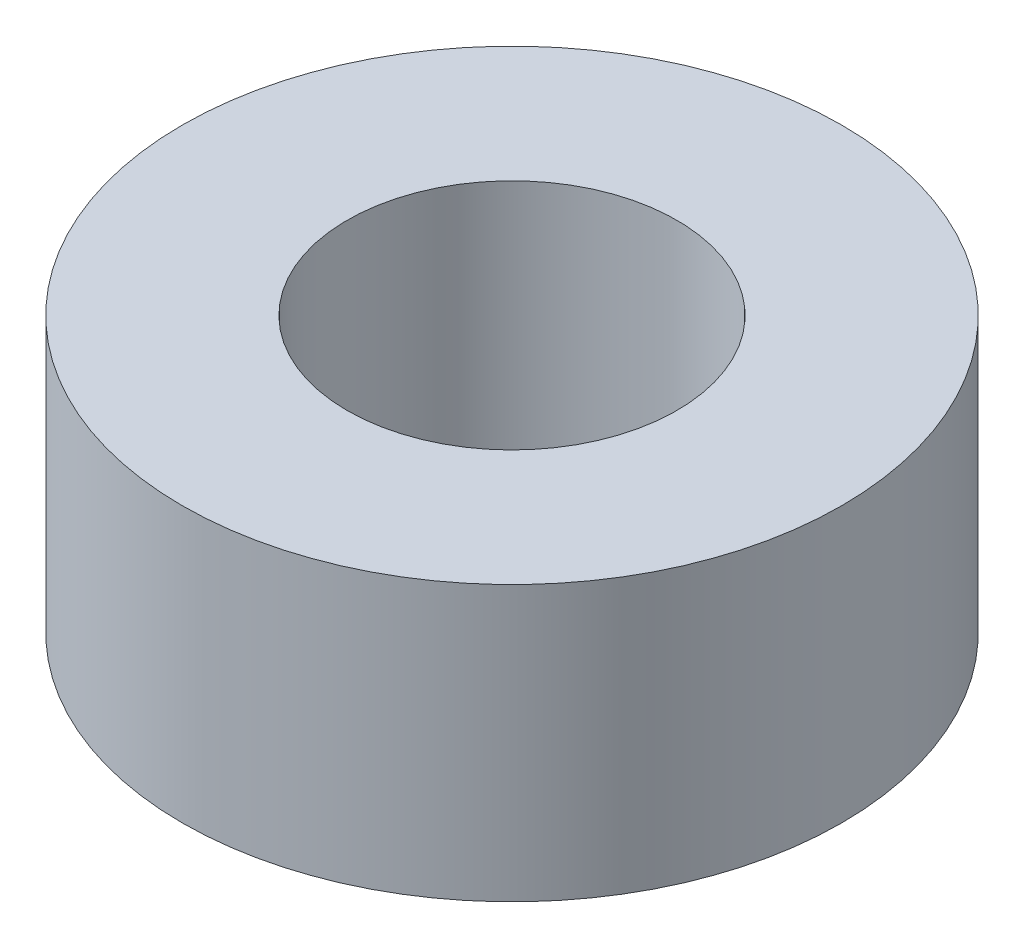
ISO-10303-21;
HEADER;
FILE_DESCRIPTION(('STEP AP214'),'2;1');
FILE_NAME('part.step','',(''),(''),'','','');
FILE_SCHEMA(('AUTOMOTIVE_DESIGN { 1 0 10303 214 1 1 1 1 }'));
ENDSEC;
DATA;
#1=APPLICATION_CONTEXT('core data for automotive mechanical design processes');
#2=APPLICATION_PROTOCOL_DEFINITION('international standard','automotive_design',2000,#1);
#3=PRODUCT_CONTEXT('',#1,'mechanical');
#4=PRODUCT('Part','Part','',(#3));
#5=PRODUCT_RELATED_PRODUCT_CATEGORY('part','',(#4));
#6=PRODUCT_DEFINITION_FORMATION('','',#4);
#7=PRODUCT_DEFINITION_CONTEXT('part definition',#1,'design');
#8=PRODUCT_DEFINITION('design','',#6,#7);
#9=PRODUCT_DEFINITION_SHAPE('','',#8);
#10=(LENGTH_UNIT() NAMED_UNIT(*) SI_UNIT(.MILLI.,.METRE.));
#11=(NAMED_UNIT(*) PLANE_ANGLE_UNIT() SI_UNIT($,.RADIAN.));
#12=(NAMED_UNIT(*) SI_UNIT($,.STERADIAN.) SOLID_ANGLE_UNIT());
#13=UNCERTAINTY_MEASURE_WITH_UNIT(LENGTH_MEASURE(1.E-05),#10,'distance_accuracy_value','');
#14=(GEOMETRIC_REPRESENTATION_CONTEXT(3) GLOBAL_UNCERTAINTY_ASSIGNED_CONTEXT((#13)) GLOBAL_UNIT_ASSIGNED_CONTEXT((#10,
#11,#12)) REPRESENTATION_CONTEXT('',''));
#15=CARTESIAN_POINT('',(0.,0.,0.));
#16=DIRECTION('',(0.,0.,1.));
#17=DIRECTION('',(1.,0.,0.));
#18=AXIS2_PLACEMENT_3D('',#15,#16,#17);
#19=CARTESIAN_POINT('',(0.,2.5,0.));
#20=DIRECTION('',(0.,1.,0.));
#21=DIRECTION('',(0.,0.,1.));
#22=AXIS2_PLACEMENT_3D('',#19,#20,#21);
#23=PLANE('',#22);
#24=CARTESIAN_POINT('',(0.,2.5,0.));
#25=DIRECTION('',(0.,1.,0.));
#26=DIRECTION('',(0.,0.,1.));
#27=AXIS2_PLACEMENT_3D('',#24,#25,#26);
#28=CIRCLE('',#27,3.);
#29=CARTESIAN_POINT('',(0.,2.5,3.));
#30=VERTEX_POINT('',#29);
#31=EDGE_CURVE('E10',#30,#30,#28,.T.);
#32=ORIENTED_EDGE('',*,*,#31,.T.);
#33=EDGE_LOOP('',(#32));
#34=FACE_BOUND('',#33,.T.);
#35=CARTESIAN_POINT('',(0.,2.5,0.));
#36=DIRECTION('',(0.,1.,0.));
#37=DIRECTION('',(0.,0.,1.));
#38=AXIS2_PLACEMENT_3D('',#35,#36,#37);
#39=CIRCLE('',#38,1.5);
#40=CARTESIAN_POINT('',(0.,2.5,1.5));
#41=VERTEX_POINT('',#40);
#42=EDGE_CURVE('E50',#41,#41,#39,.T.);
#43=ORIENTED_EDGE('',*,*,#42,.F.);
#44=EDGE_LOOP('',(#43));
#45=FACE_BOUND('',#44,.T.);
#46=ADVANCED_FACE('F39',(#34,#45),#23,.T.);
#47=CARTESIAN_POINT('',(0.,0.,0.));
#48=DIRECTION('',(0.,1.,0.));
#49=DIRECTION('',(0.,0.,1.));
#50=AXIS2_PLACEMENT_3D('',#47,#48,#49);
#51=PLANE('',#50);
#52=CARTESIAN_POINT('',(0.,0.,0.));
#53=DIRECTION('',(0.,1.,0.));
#54=DIRECTION('',(0.,0.,1.));
#55=AXIS2_PLACEMENT_3D('',#52,#53,#54);
#56=CIRCLE('',#55,3.);
#57=CARTESIAN_POINT('',(0.,0.,3.));
#58=VERTEX_POINT('',#57);
#59=EDGE_CURVE('E43',#58,#58,#56,.T.);
#60=ORIENTED_EDGE('',*,*,#59,.F.);
#61=EDGE_LOOP('',(#60));
#62=FACE_BOUND('',#61,.T.);
#63=CARTESIAN_POINT('',(0.,0.,0.));
#64=DIRECTION('',(0.,1.,0.));
#65=DIRECTION('',(0.,0.,1.));
#66=AXIS2_PLACEMENT_3D('',#63,#64,#65);
#67=CIRCLE('',#66,1.5);
#68=CARTESIAN_POINT('',(0.,0.,1.5));
#69=VERTEX_POINT('',#68);
#70=EDGE_CURVE('E52',#69,#69,#67,.T.);
#71=ORIENTED_EDGE('',*,*,#70,.T.);
#72=EDGE_LOOP('',(#71));
#73=FACE_BOUND('',#72,.T.);
#74=ADVANCED_FACE('F62',(#62,#73),#51,.F.);
#75=CARTESIAN_POINT('',(0.,2.5,0.));
#76=DIRECTION('',(0.,-1.,0.));
#77=DIRECTION('',(0.,0.,-1.));
#78=AXIS2_PLACEMENT_3D('',#75,#76,#77);
#79=CYLINDRICAL_SURFACE('',#78,3.);
#80=ORIENTED_EDGE('',*,*,#31,.F.);
#81=EDGE_LOOP('',(#80));
#82=FACE_BOUND('',#81,.T.);
#83=ORIENTED_EDGE('',*,*,#59,.T.);
#84=EDGE_LOOP('',(#83));
#85=FACE_BOUND('',#84,.T.);
#86=ADVANCED_FACE('F41',(#82,#85),#79,.T.);
#87=CARTESIAN_POINT('',(0.,2.5,0.));
#88=DIRECTION('',(0.,-1.,0.));
#89=DIRECTION('',(0.,0.,-1.));
#90=AXIS2_PLACEMENT_3D('',#87,#88,#89);
#91=CYLINDRICAL_SURFACE('',#90,1.5);
#92=ORIENTED_EDGE('',*,*,#42,.T.);
#93=EDGE_LOOP('',(#92));
#94=FACE_BOUND('',#93,.T.);
#95=ORIENTED_EDGE('',*,*,#70,.F.);
#96=EDGE_LOOP('',(#95));
#97=FACE_BOUND('',#96,.T.);
#98=ADVANCED_FACE('F58',(#94,#97),#91,.F.);
#99=CLOSED_SHELL('',(#46,#74,#86,#98));
#100=MANIFOLD_SOLID_BREP('B2',#99);
#101=ADVANCED_BREP_SHAPE_REPRESENTATION('',(#18,#100),#14);
#102=SHAPE_DEFINITION_REPRESENTATION(#9,#101);
ENDSEC;
END-ISO-10303-21;
